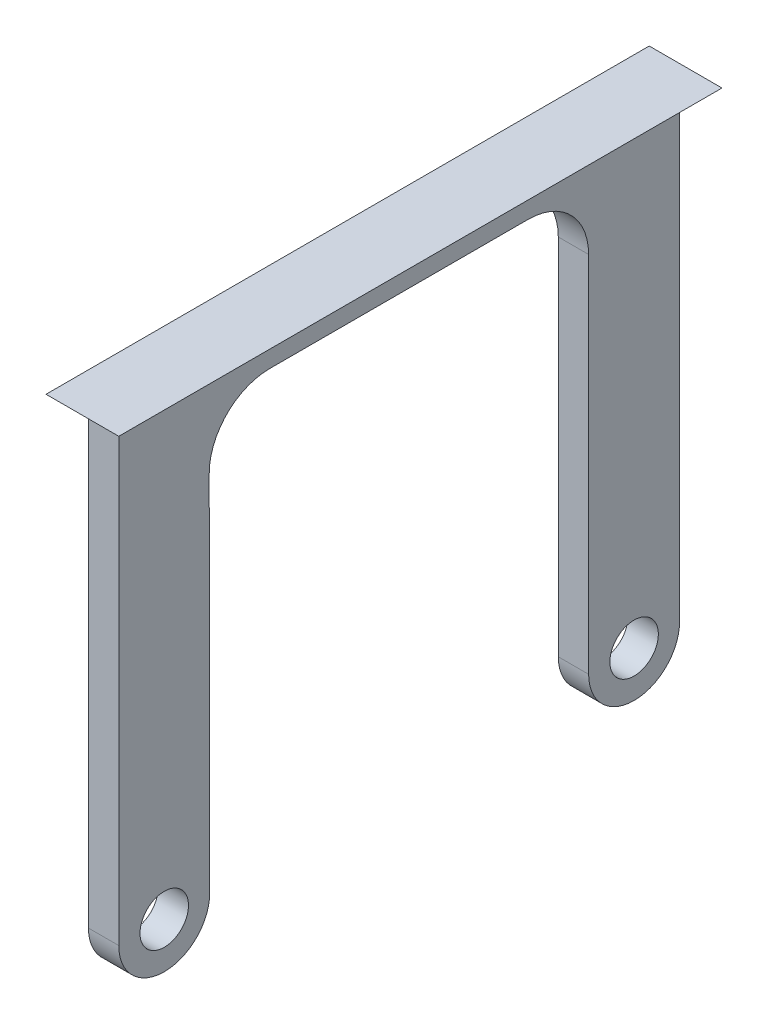
ISO-10303-21;
HEADER;
FILE_DESCRIPTION(('STEP AP214'),'2;1');
FILE_NAME('part.step','',(''),(''),'','','');
FILE_SCHEMA(('AUTOMOTIVE_DESIGN { 1 0 10303 214 1 1 1 1 }'));
ENDSEC;
DATA;
#1=APPLICATION_CONTEXT('core data for automotive mechanical design processes');
#2=APPLICATION_PROTOCOL_DEFINITION('international standard','automotive_design',2000,#1);
#3=PRODUCT_CONTEXT('',#1,'mechanical');
#4=PRODUCT('Part','Part','',(#3));
#5=PRODUCT_RELATED_PRODUCT_CATEGORY('part','',(#4));
#6=PRODUCT_DEFINITION_FORMATION('','',#4);
#7=PRODUCT_DEFINITION_CONTEXT('part definition',#1,'design');
#8=PRODUCT_DEFINITION('design','',#6,#7);
#9=PRODUCT_DEFINITION_SHAPE('','',#8);
#10=(LENGTH_UNIT() NAMED_UNIT(*) SI_UNIT(.MILLI.,.METRE.));
#11=(NAMED_UNIT(*) PLANE_ANGLE_UNIT() SI_UNIT($,.RADIAN.));
#12=(NAMED_UNIT(*) SI_UNIT($,.STERADIAN.) SOLID_ANGLE_UNIT());
#13=UNCERTAINTY_MEASURE_WITH_UNIT(LENGTH_MEASURE(1.E-05),#10,'distance_accuracy_value','');
#14=(GEOMETRIC_REPRESENTATION_CONTEXT(3) GLOBAL_UNCERTAINTY_ASSIGNED_CONTEXT((#13)) GLOBAL_UNIT_ASSIGNED_CONTEXT((#10,
#11,#12)) REPRESENTATION_CONTEXT('',''));
#15=CARTESIAN_POINT('',(0.,0.,0.));
#16=DIRECTION('',(0.,0.,1.));
#17=DIRECTION('',(1.,0.,0.));
#18=AXIS2_PLACEMENT_3D('',#15,#16,#17);
#19=CARTESIAN_POINT('',(43.5526896518253,5.18551571692412,2.50000000000003));
#20=DIRECTION('',(0.,-1.,0.));
#21=DIRECTION('',(0.,0.,-1.));
#22=AXIS2_PLACEMENT_3D('',#19,#20,#21);
#23=PLANE('',#22);
#24=DIRECTION('',(1.,0.,0.));
#25=VECTOR('',#24,1.);
#26=CARTESIAN_POINT('',(33.2516896518253,5.18551571692412,2.60000000000002));
#27=LINE('',#26,#25);
#28=CARTESIAN_POINT('',(36.6526896518253,5.18551571692412,2.60000000000002));
#29=VERTEX_POINT('',#28);
#30=CARTESIAN_POINT('',(31.8516896518253,5.18551571692412,2.60000000000002));
#31=VERTEX_POINT('',#30);
#32=EDGE_CURVE('E363',#29,#31,#27,.F.);
#33=ORIENTED_EDGE('',*,*,#32,.T.);
#34=DIRECTION('',(0.,0.,-1.));
#35=VECTOR('',#34,1.);
#36=CARTESIAN_POINT('',(31.8516896518253,5.18551571692412,41.));
#37=LINE('',#36,#35);
#38=CARTESIAN_POINT('',(31.8516896518253,5.18551571692412,42.4));
#39=VERTEX_POINT('',#38);
#40=EDGE_CURVE('E358',#31,#39,#37,.F.);
#41=ORIENTED_EDGE('',*,*,#40,.T.);
#42=DIRECTION('',(1.,0.,0.));
#43=VECTOR('',#42,1.);
#44=CARTESIAN_POINT('',(35.2526896518253,5.18551571692412,42.4));
#45=LINE('',#44,#43);
#46=CARTESIAN_POINT('',(36.6526896518253,5.18551571692412,42.4));
#47=VERTEX_POINT('',#46);
#48=EDGE_CURVE('E11',#39,#47,#45,.T.);
#49=ORIENTED_EDGE('',*,*,#48,.T.);
#50=DIRECTION('',(0.,0.,-1.));
#51=VECTOR('',#50,1.);
#52=CARTESIAN_POINT('',(36.6526896518253,5.18551571692412,45.));
#53=LINE('',#52,#51);
#54=EDGE_CURVE('E40',#47,#29,#53,.T.);
#55=ORIENTED_EDGE('',*,*,#54,.T.);
#56=EDGE_LOOP('',(#33,#41,#49,#55));
#57=FACE_BOUND('',#56,.T.);
#58=ADVANCED_FACE('F32',(#57),#23,.F.);
#59=CARTESIAN_POINT('',(33.2526896518253,-25.3144842830759,7.00000000000002));
#60=DIRECTION('',(-1.,0.,0.));
#61=DIRECTION('',(0.,0.,1.));
#62=AXIS2_PLACEMENT_3D('',#59,#60,#61);
#63=PLANE('',#62);
#64=CARTESIAN_POINT('',(33.2526896518253,-25.3144842830759,7.00000000000002));
#65=DIRECTION('',(-1.,0.,0.));
#66=DIRECTION('',(0.,0.,1.));
#67=AXIS2_PLACEMENT_3D('',#64,#65,#66);
#68=CIRCLE('',#67,3.);
#69=CARTESIAN_POINT('',(33.2526896518253,-25.3144842830759,10.));
#70=VERTEX_POINT('',#69);
#71=CARTESIAN_POINT('',(33.2526896518253,-25.3144842830759,4.00000000000002));
#72=VERTEX_POINT('',#71);
#73=EDGE_CURVE('E159',#70,#72,#68,.T.);
#74=ORIENTED_EDGE('',*,*,#73,.T.);
#75=EDGE_CURVE('E156',#72,#70,#68,.T.);
#76=ORIENTED_EDGE('',*,*,#75,.T.);
#77=EDGE_LOOP('',(#74,#76));
#78=FACE_BOUND('',#77,.T.);
#79=CARTESIAN_POINT('',(33.2526896518253,-25.3144842830759,7.00000000000002));
#80=DIRECTION('',(-1.,0.,0.));
#81=DIRECTION('',(0.,0.,1.));
#82=AXIS2_PLACEMENT_3D('',#79,#80,#81);
#83=CIRCLE('',#82,1.6);
#84=CARTESIAN_POINT('',(33.2526896518253,-25.3144842830759,8.60000000000002));
#85=VERTEX_POINT('',#84);
#86=EDGE_CURVE('E157',#85,#85,#83,.T.);
#87=ORIENTED_EDGE('',*,*,#86,.F.);
#88=EDGE_LOOP('',(#87));
#89=FACE_BOUND('',#88,.T.);
#90=ADVANCED_FACE('F316',(#78,#89),#63,.T.);
#91=CARTESIAN_POINT('',(33.2526896518253,-25.3144842830759,7.00000000000002));
#92=DIRECTION('',(1.,0.,0.));
#93=DIRECTION('',(0.,0.,-1.));
#94=AXIS2_PLACEMENT_3D('',#91,#92,#93);
#95=CYLINDRICAL_SURFACE('',#94,1.6);
#96=ORIENTED_EDGE('',*,*,#86,.T.);
#97=EDGE_LOOP('',(#96));
#98=FACE_BOUND('',#97,.T.);
#99=CARTESIAN_POINT('',(35.2526896518253,-25.3144842830759,7.00000000000002));
#100=DIRECTION('',(-1.,0.,0.));
#101=DIRECTION('',(0.,0.,1.));
#102=AXIS2_PLACEMENT_3D('',#99,#100,#101);
#103=CIRCLE('',#102,1.6);
#104=CARTESIAN_POINT('',(35.2526896518253,-25.3144842830759,8.60000000000002));
#105=VERTEX_POINT('',#104);
#106=EDGE_CURVE('E162',#105,#105,#103,.T.);
#107=ORIENTED_EDGE('',*,*,#106,.F.);
#108=EDGE_LOOP('',(#107));
#109=FACE_BOUND('',#108,.T.);
#110=ADVANCED_FACE('F322',(#98,#109),#95,.F.);
#111=CARTESIAN_POINT('',(33.2526896518253,-25.3144842830759,38.));
#112=DIRECTION('',(1.,0.,0.));
#113=DIRECTION('',(0.,0.,-1.));
#114=AXIS2_PLACEMENT_3D('',#111,#112,#113);
#115=CYLINDRICAL_SURFACE('',#114,1.6);
#116=CARTESIAN_POINT('',(33.2526896518253,-25.3144842830759,38.));
#117=DIRECTION('',(-1.,0.,0.));
#118=DIRECTION('',(0.,0.,1.));
#119=AXIS2_PLACEMENT_3D('',#116,#117,#118);
#120=CIRCLE('',#119,1.6);
#121=CARTESIAN_POINT('',(33.2526896518253,-25.3144842830759,39.6));
#122=VERTEX_POINT('',#121);
#123=EDGE_CURVE('E167',#122,#122,#120,.T.);
#124=ORIENTED_EDGE('',*,*,#123,.T.);
#125=EDGE_LOOP('',(#124));
#126=FACE_BOUND('',#125,.T.);
#127=CARTESIAN_POINT('',(35.2526896518253,-25.3144842830759,38.));
#128=DIRECTION('',(-1.,0.,0.));
#129=DIRECTION('',(0.,0.,1.));
#130=AXIS2_PLACEMENT_3D('',#127,#128,#129);
#131=CIRCLE('',#130,1.6);
#132=CARTESIAN_POINT('',(35.2526896518253,-25.3144842830759,39.6));
#133=VERTEX_POINT('',#132);
#134=EDGE_CURVE('E151',#133,#133,#131,.T.);
#135=ORIENTED_EDGE('',*,*,#134,.F.);
#136=EDGE_LOOP('',(#135));
#137=FACE_BOUND('',#136,.T.);
#138=ADVANCED_FACE('F204',(#126,#137),#115,.F.);
#139=CARTESIAN_POINT('',(33.2526896518253,-25.3144842830759,38.));
#140=DIRECTION('',(1.,0.,0.));
#141=DIRECTION('',(0.,0.,-1.));
#142=AXIS2_PLACEMENT_3D('',#139,#140,#141);
#143=CYLINDRICAL_SURFACE('',#142,3.);
#144=CARTESIAN_POINT('',(33.2526896518253,-25.3144842830759,38.));
#145=DIRECTION('',(-1.,0.,0.));
#146=DIRECTION('',(0.,0.,1.));
#147=AXIS2_PLACEMENT_3D('',#144,#145,#146);
#148=CIRCLE('',#147,3.);
#149=CARTESIAN_POINT('',(33.2526896518253,-25.3103570631996,35.000002838992));
#150=VERTEX_POINT('',#149);
#151=CARTESIAN_POINT('',(33.2524396518253,-25.3144842830759,41.));
#152=VERTEX_POINT('',#151);
#153=EDGE_CURVE('E177',#150,#152,#148,.T.);
#154=ORIENTED_EDGE('',*,*,#153,.F.);
#155=CARTESIAN_POINT('',(35.2526896518253,-25.3103570671053,35.0000056779813));
#156=DIRECTION('',(-1.,0.,0.));
#157=VECTOR('',#156,1.);
#158=LINE('',#155,#157);
#159=CARTESIAN_POINT('',(35.2526896518253,-25.3124206731378,35.000001419496));
#160=VERTEX_POINT('',#159);
#161=EDGE_CURVE('E187',#160,#150,#158,.T.);
#162=ORIENTED_EDGE('',*,*,#161,.F.);
#163=CARTESIAN_POINT('',(35.2526896518253,-25.3144842830759,38.));
#164=DIRECTION('',(-1.,0.,0.));
#165=DIRECTION('',(0.,0.,1.));
#166=AXIS2_PLACEMENT_3D('',#163,#164,#165);
#167=CIRCLE('',#166,3.);
#168=CARTESIAN_POINT('',(35.2526896518253,-25.3144842830759,41.));
#169=VERTEX_POINT('',#168);
#170=EDGE_CURVE('E170',#160,#169,#167,.T.);
#171=ORIENTED_EDGE('',*,*,#170,.T.);
#172=DIRECTION('',(1.,0.,0.));
#173=VECTOR('',#172,1.);
#174=CARTESIAN_POINT('',(33.2526896518253,-25.3144842830759,41.));
#175=LINE('',#174,#173);
#176=EDGE_CURVE('E140',#169,#152,#175,.F.);
#177=ORIENTED_EDGE('',*,*,#176,.T.);
#178=EDGE_LOOP('',(#154,#162,#171,#177));
#179=FACE_BOUND('',#178,.T.);
#180=ADVANCED_FACE('F194',(#179),#143,.T.);
#181=CARTESIAN_POINT('',(33.2526896518253,-25.3144842830759,7.00000000000002));
#182=DIRECTION('',(1.,0.,0.));
#183=DIRECTION('',(0.,0.,-1.));
#184=AXIS2_PLACEMENT_3D('',#181,#182,#183);
#185=CYLINDRICAL_SURFACE('',#184,3.);
#186=CARTESIAN_POINT('',(35.2526896518253,-25.3144842830759,7.00000000000002));
#187=DIRECTION('',(-1.,0.,0.));
#188=DIRECTION('',(0.,0.,1.));
#189=AXIS2_PLACEMENT_3D('',#186,#187,#188);
#190=CIRCLE('',#189,3.);
#191=CARTESIAN_POINT('',(35.2526896518253,-25.3144842830759,4.00000000000002));
#192=VERTEX_POINT('',#191);
#193=CARTESIAN_POINT('',(35.2526896518253,-25.3144842830759,10.));
#194=VERTEX_POINT('',#193);
#195=EDGE_CURVE('E134',#192,#194,#190,.T.);
#196=ORIENTED_EDGE('',*,*,#195,.T.);
#197=DIRECTION('',(1.,0.,0.));
#198=VECTOR('',#197,1.);
#199=CARTESIAN_POINT('',(33.2526896518253,-25.3144842830759,10.));
#200=LINE('',#199,#198);
#201=EDGE_CURVE('E144',#194,#70,#200,.F.);
#202=ORIENTED_EDGE('',*,*,#201,.T.);
#203=ORIENTED_EDGE('',*,*,#75,.F.);
#204=DIRECTION('',(1.,0.,0.));
#205=VECTOR('',#204,1.);
#206=CARTESIAN_POINT('',(33.2526896518253,-25.3144842830759,4.00000000000002));
#207=LINE('',#206,#205);
#208=EDGE_CURVE('E152',#192,#72,#207,.F.);
#209=ORIENTED_EDGE('',*,*,#208,.F.);
#210=EDGE_LOOP('',(#196,#202,#203,#209));
#211=FACE_BOUND('',#210,.T.);
#212=ADVANCED_FACE('F155',(#211),#185,.T.);
#213=CARTESIAN_POINT('',(33.2526896518253,-25.3144842830759,38.));
#214=DIRECTION('',(-1.,0.,0.));
#215=DIRECTION('',(0.,0.,1.));
#216=AXIS2_PLACEMENT_3D('',#213,#214,#215);
#217=PLANE('',#216);
#218=CARTESIAN_POINT('',(33.2526896518253,-25.3144842830759,41.));
#219=CARTESIAN_POINT('',(33.2526896518253,-24.7183013313696,41.));
#220=CARTESIAN_POINT('',(33.2526896518253,-24.1669106348504,40.7718359839461));
#221=CARTESIAN_POINT('',(33.2526896518253,-23.6162723328336,40.5439833067531));
#222=CARTESIAN_POINT('',(33.2526896518253,-23.1938936614894,40.122049814599));
#223=CARTESIAN_POINT('',(33.2526896518253,-22.7722932176084,39.7008937296709));
#224=CARTESIAN_POINT('',(33.2526896518253,-22.5434383365467,39.1494800399416));
#225=CARTESIAN_POINT('',(33.2526896518253,-22.3150051177659,38.5990823230989));
#226=CARTESIAN_POINT('',(33.2526896518253,-22.314484992824,38.0020636104264));
#227=CARTESIAN_POINT('',(33.2526896518253,-22.3139658262058,37.4061448973315));
#228=CARTESIAN_POINT('',(33.2526896518253,-22.5418595732497,36.8543332864828));
#229=CARTESIAN_POINT('',(33.2526896518253,-22.7693334288906,36.3035383816847));
#230=CARTESIAN_POINT('',(33.2526896518253,-23.1909762795449,35.8808695748161));
#231=CARTESIAN_POINT('',(33.2526896518253,-23.6118422584793,35.4589795299791));
#232=CARTESIAN_POINT('',(33.2526896518253,-24.1630983953123,35.2297454020508));
#233=CARTESIAN_POINT('',(33.2526896518253,-24.7136029342889,35.0008238182696));
#234=CARTESIAN_POINT('',(33.2526896518253,-25.3103570631996,35.000002838992));
#235=B_SPLINE_CURVE_WITH_KNOTS('',2,(#218,#219,#220,#221,#222,#223,#224,#225,#226,#227,#228,
#229,#230,#231,#232,#233,#234),.UNSPECIFIED.,.F.,.F.,(3,2,2,2,2,2,2,2,3),(0.,0.125,0.25,0.375,
0.5,0.625,0.75,0.875,1.),.UNSPECIFIED.);
#236=EDGE_CURVE('E180',#152,#150,#235,.T.);
#237=ORIENTED_EDGE('',*,*,#236,.T.);
#238=ORIENTED_EDGE('',*,*,#153,.T.);
#239=EDGE_LOOP('',(#237,#238));
#240=FACE_BOUND('',#239,.T.);
#241=ORIENTED_EDGE('',*,*,#123,.F.);
#242=EDGE_LOOP('',(#241));
#243=FACE_BOUND('',#242,.T.);
#244=ADVANCED_FACE('F205',(#240,#243),#217,.T.);
#245=CARTESIAN_POINT('',(33.2516896518253,-25.3144842830759,35.));
#246=DIRECTION('',(0.,-0.00137573995875575,0.999999053669335));
#247=DIRECTION('',(0.,-0.999999053669335,-0.00137573995875575));
#248=AXIS2_PLACEMENT_3D('',#245,#246,#247);
#249=PLANE('',#248);
#250=DIRECTION('',(1.,0.,0.));
#251=VECTOR('',#250,1.);
#252=CARTESIAN_POINT('',(33.2516896518253,-1.33080092857577,35.0329953427735));
#253=LINE('',#252,#251);
#254=CARTESIAN_POINT('',(33.2516896518253,-1.33080092857577,35.0329953427735));
#255=VERTEX_POINT('',#254);
#256=CARTESIAN_POINT('',(35.2526896518253,-1.33080092857577,35.0329953427735));
#257=VERTEX_POINT('',#256);
#258=EDGE_CURVE('E264',#255,#257,#253,.T.);
#259=ORIENTED_EDGE('',*,*,#258,.T.);
#260=DIRECTION('',(0.,-0.999999053669335,-0.00137573995875575));
#261=VECTOR('',#260,1.);
#262=CARTESIAN_POINT('',(35.2526896518253,-25.3144842830759,35.));
#263=LINE('',#262,#261);
#264=EDGE_CURVE('E227',#257,#160,#263,.T.);
#265=ORIENTED_EDGE('',*,*,#264,.T.);
#266=ORIENTED_EDGE('',*,*,#161,.T.);
#267=DIRECTION('',(0.,-0.999999053669335,-0.00137573995875575));
#268=VECTOR('',#267,1.);
#269=CARTESIAN_POINT('',(33.2516896518253,-25.3144842830759,35.));
#270=LINE('',#269,#268);
#271=EDGE_CURVE('E257',#255,#150,#270,.T.);
#272=ORIENTED_EDGE('',*,*,#271,.F.);
#273=EDGE_LOOP('',(#259,#265,#266,#272));
#274=FACE_BOUND('',#273,.T.);
#275=ADVANCED_FACE('F305',(#274),#249,.F.);
#276=CARTESIAN_POINT('',(33.2516896518253,-1.32529796874072,31.0329991280961));
#277=DIRECTION('',(1.,0.,0.));
#278=DIRECTION('',(0.,0.,-1.));
#279=AXIS2_PLACEMENT_3D('',#276,#277,#278);
#280=CYLINDRICAL_SURFACE('',#279,4.);
#281=DIRECTION('',(1.,0.,0.));
#282=VECTOR('',#281,1.);
#283=CARTESIAN_POINT('',(33.2516896518253,2.67470203125928,31.0329991280961));
#284=LINE('',#283,#282);
#285=CARTESIAN_POINT('',(33.2516896518253,2.67470203125928,31.0329991280961));
#286=VERTEX_POINT('',#285);
#287=CARTESIAN_POINT('',(35.2526896518253,2.67470203125928,31.0329991280961));
#288=VERTEX_POINT('',#287);
#289=EDGE_CURVE('E266',#286,#288,#284,.T.);
#290=ORIENTED_EDGE('',*,*,#289,.T.);
#291=CARTESIAN_POINT('',(35.2526896518253,-1.32529796874072,31.0329991280961));
#292=DIRECTION('',(1.,0.,0.));
#293=DIRECTION('',(0.,0.,-1.));
#294=AXIS2_PLACEMENT_3D('',#291,#292,#293);
#295=CIRCLE('',#294,4.);
#296=EDGE_CURVE('E236',#288,#257,#295,.T.);
#297=ORIENTED_EDGE('',*,*,#296,.T.);
#298=ORIENTED_EDGE('',*,*,#258,.F.);
#299=CARTESIAN_POINT('',(33.2516896518253,-1.32529796874072,31.0329991280961));
#300=DIRECTION('',(1.,0.,0.));
#301=DIRECTION('',(0.,0.,-1.));
#302=AXIS2_PLACEMENT_3D('',#299,#300,#301);
#303=CIRCLE('',#302,4.);
#304=EDGE_CURVE('E255',#286,#255,#303,.T.);
#305=ORIENTED_EDGE('',*,*,#304,.F.);
#306=EDGE_LOOP('',(#290,#297,#298,#305));
#307=FACE_BOUND('',#306,.T.);
#308=ADVANCED_FACE('F302',(#307),#280,.F.);
#309=CARTESIAN_POINT('',(33.2516896518253,2.67470203125928,14.));
#310=DIRECTION('',(0.,1.,0.));
#311=DIRECTION('',(0.,0.,1.));
#312=AXIS2_PLACEMENT_3D('',#309,#310,#311);
#313=PLANE('',#312);
#314=DIRECTION('',(1.,0.,0.));
#315=VECTOR('',#314,1.);
#316=CARTESIAN_POINT('',(33.2516896518253,2.67470203125928,14.));
#317=LINE('',#316,#315);
#318=CARTESIAN_POINT('',(33.2516896518253,2.67470203125928,14.));
#319=VERTEX_POINT('',#318);
#320=CARTESIAN_POINT('',(35.2526896518253,2.67470203125928,14.));
#321=VERTEX_POINT('',#320);
#322=EDGE_CURVE('E268',#319,#321,#317,.T.);
#323=ORIENTED_EDGE('',*,*,#322,.T.);
#324=DIRECTION('',(0.,0.,1.));
#325=VECTOR('',#324,1.);
#326=CARTESIAN_POINT('',(35.2526896518253,2.67470203125928,14.));
#327=LINE('',#326,#325);
#328=EDGE_CURVE('E295',#321,#288,#327,.T.);
#329=ORIENTED_EDGE('',*,*,#328,.T.);
#330=ORIENTED_EDGE('',*,*,#289,.F.);
#331=DIRECTION('',(0.,0.,1.));
#332=VECTOR('',#331,1.);
#333=CARTESIAN_POINT('',(33.2516896518253,2.67470203125928,14.));
#334=LINE('',#333,#332);
#335=EDGE_CURVE('E253',#319,#286,#334,.T.);
#336=ORIENTED_EDGE('',*,*,#335,.F.);
#337=EDGE_LOOP('',(#323,#329,#330,#336));
#338=FACE_BOUND('',#337,.T.);
#339=ADVANCED_FACE('F312',(#338),#313,.F.);
#340=CARTESIAN_POINT('',(33.2516896518253,-1.32529796874072,14.));
#341=DIRECTION('',(1.,0.,0.));
#342=DIRECTION('',(0.,0.,-1.));
#343=AXIS2_PLACEMENT_3D('',#340,#341,#342);
#344=CYLINDRICAL_SURFACE('',#343,4.);
#345=DIRECTION('',(1.,0.,0.));
#346=VECTOR('',#345,1.);
#347=CARTESIAN_POINT('',(33.2516896518253,-1.32529796874075,10.));
#348=LINE('',#347,#346);
#349=CARTESIAN_POINT('',(33.2516896518253,-1.32529796874075,10.));
#350=VERTEX_POINT('',#349);
#351=CARTESIAN_POINT('',(35.2526896518253,-1.32529796874075,10.));
#352=VERTEX_POINT('',#351);
#353=EDGE_CURVE('E270',#350,#352,#348,.T.);
#354=ORIENTED_EDGE('',*,*,#353,.T.);
#355=CARTESIAN_POINT('',(35.2526896518253,-1.32529796874072,14.));
#356=DIRECTION('',(1.,0.,0.));
#357=DIRECTION('',(0.,0.,1.));
#358=AXIS2_PLACEMENT_3D('',#355,#356,#357);
#359=CIRCLE('',#358,4.);
#360=EDGE_CURVE('E137',#352,#321,#359,.T.);
#361=ORIENTED_EDGE('',*,*,#360,.T.);
#362=ORIENTED_EDGE('',*,*,#322,.F.);
#363=CARTESIAN_POINT('',(33.2516896518253,-1.32529796874072,14.));
#364=DIRECTION('',(1.,0.,0.));
#365=DIRECTION('',(0.,0.,1.));
#366=AXIS2_PLACEMENT_3D('',#363,#364,#365);
#367=CIRCLE('',#366,4.);
#368=EDGE_CURVE('E251',#350,#319,#367,.T.);
#369=ORIENTED_EDGE('',*,*,#368,.F.);
#370=EDGE_LOOP('',(#354,#361,#362,#369));
#371=FACE_BOUND('',#370,.T.);
#372=ADVANCED_FACE('F382',(#371),#344,.F.);
#373=CARTESIAN_POINT('',(33.2516896518253,-1.32529796874075,10.));
#374=DIRECTION('',(0.,0.,-1.));
#375=DIRECTION('',(0.,1.,0.));
#376=AXIS2_PLACEMENT_3D('',#373,#374,#375);
#377=PLANE('',#376);
#378=DIRECTION('',(1.,0.,0.));
#379=VECTOR('',#378,1.);
#380=CARTESIAN_POINT('',(33.2516896518253,-25.3144842830759,10.));
#381=LINE('',#380,#379);
#382=CARTESIAN_POINT('',(33.2516896518253,-25.3144842830759,10.));
#383=VERTEX_POINT('',#382);
#384=EDGE_CURVE('E147',#383,#70,#381,.T.);
#385=ORIENTED_EDGE('',*,*,#384,.T.);
#386=ORIENTED_EDGE('',*,*,#201,.F.);
#387=DIRECTION('',(0.,1.,0.));
#388=VECTOR('',#387,1.);
#389=CARTESIAN_POINT('',(35.2526896518253,-1.32529796874075,10.));
#390=LINE('',#389,#388);
#391=EDGE_CURVE('E128',#194,#352,#390,.T.);
#392=ORIENTED_EDGE('',*,*,#391,.T.);
#393=ORIENTED_EDGE('',*,*,#353,.F.);
#394=DIRECTION('',(0.,1.,0.));
#395=VECTOR('',#394,1.);
#396=CARTESIAN_POINT('',(33.2516896518253,-1.32529796874075,10.));
#397=LINE('',#396,#395);
#398=EDGE_CURVE('E249',#383,#350,#397,.T.);
#399=ORIENTED_EDGE('',*,*,#398,.F.);
#400=EDGE_LOOP('',(#385,#386,#392,#393,#399));
#401=FACE_BOUND('',#400,.T.);
#402=ADVANCED_FACE('F145',(#401),#377,.F.);
#403=CARTESIAN_POINT('',(33.2516896518253,-25.3144842830759,7.00000000000002));
#404=DIRECTION('',(1.,0.,0.));
#405=DIRECTION('',(0.,0.,-1.));
#406=AXIS2_PLACEMENT_3D('',#403,#404,#405);
#407=CYLINDRICAL_SURFACE('',#406,3.);
#408=DIRECTION('',(1.,0.,0.));
#409=VECTOR('',#408,1.);
#410=CARTESIAN_POINT('',(33.2516896518253,-25.3144842830759,4.00000000000002));
#411=LINE('',#410,#409);
#412=CARTESIAN_POINT('',(33.2516896518253,-25.3144842830759,4.00000000000002));
#413=VERTEX_POINT('',#412);
#414=EDGE_CURVE('E260',#413,#72,#411,.T.);
#415=ORIENTED_EDGE('',*,*,#414,.T.);
#416=ORIENTED_EDGE('',*,*,#73,.F.);
#417=ORIENTED_EDGE('',*,*,#384,.F.);
#418=CARTESIAN_POINT('',(33.2516896518253,-25.3144842830759,7.00000000000002));
#419=DIRECTION('',(1.,0.,0.));
#420=DIRECTION('',(0.,0.,-1.));
#421=AXIS2_PLACEMENT_3D('',#418,#419,#420);
#422=CIRCLE('',#421,3.);
#423=EDGE_CURVE('E246',#413,#383,#422,.T.);
#424=ORIENTED_EDGE('',*,*,#423,.F.);
#425=EDGE_LOOP('',(#415,#416,#417,#424));
#426=FACE_BOUND('',#425,.T.);
#427=ADVANCED_FACE('F211',(#426),#407,.F.);
#428=CARTESIAN_POINT('',(35.2526896518253,-25.3144842830759,7.00000000000002));
#429=DIRECTION('',(1.,0.,0.));
#430=DIRECTION('',(0.,0.,-1.));
#431=AXIS2_PLACEMENT_3D('',#428,#429,#430);
#432=PLANE('',#431);
#433=DIRECTION('',(0.,-1.,0.));
#434=VECTOR('',#433,1.);
#435=CARTESIAN_POINT('',(35.2526896518253,-25.3144842830759,4.00000000000002));
#436=LINE('',#435,#434);
#437=CARTESIAN_POINT('',(35.2526896518253,3.78551571692411,4.00000000000002));
#438=VERTEX_POINT('',#437);
#439=EDGE_CURVE('E244',#438,#192,#436,.T.);
#440=ORIENTED_EDGE('',*,*,#439,.F.);
#441=DIRECTION('',(0.,0.,-1.));
#442=VECTOR('',#441,1.);
#443=CARTESIAN_POINT('',(35.2526896518253,3.78551571692412,7.00000000000002));
#444=LINE('',#443,#442);
#445=CARTESIAN_POINT('',(35.2526896518253,3.78551571692412,41.));
#446=VERTEX_POINT('',#445);
#447=EDGE_CURVE('E348',#438,#446,#444,.F.);
#448=ORIENTED_EDGE('',*,*,#447,.T.);
#449=DIRECTION('',(0.,1.,0.));
#450=VECTOR('',#449,1.);
#451=CARTESIAN_POINT('',(35.2526896518253,5.18551571692412,41.));
#452=LINE('',#451,#450);
#453=EDGE_CURVE('E235',#169,#446,#452,.T.);
#454=ORIENTED_EDGE('',*,*,#453,.F.);
#455=ORIENTED_EDGE('',*,*,#170,.F.);
#456=ORIENTED_EDGE('',*,*,#264,.F.);
#457=ORIENTED_EDGE('',*,*,#296,.F.);
#458=ORIENTED_EDGE('',*,*,#328,.F.);
#459=ORIENTED_EDGE('',*,*,#360,.F.);
#460=ORIENTED_EDGE('',*,*,#391,.F.);
#461=ORIENTED_EDGE('',*,*,#195,.F.);
#462=EDGE_LOOP('',(#440,#448,#454,#455,#456,#457,#458,#459,#460,#461));
#463=FACE_BOUND('',#462,.T.);
#464=ORIENTED_EDGE('',*,*,#134,.T.);
#465=EDGE_LOOP('',(#464));
#466=FACE_BOUND('',#465,.T.);
#467=ORIENTED_EDGE('',*,*,#106,.T.);
#468=EDGE_LOOP('',(#467));
#469=FACE_BOUND('',#468,.T.);
#470=ADVANCED_FACE('F131',(#463,#466,#469),#432,.T.);
#471=CARTESIAN_POINT('',(33.2516896518253,5.18551571692412,41.));
#472=DIRECTION('',(0.,0.,-1.));
#473=DIRECTION('',(-1.,0.,0.));
#474=AXIS2_PLACEMENT_3D('',#471,#472,#473);
#475=PLANE('',#474);
#476=ORIENTED_EDGE('',*,*,#453,.T.);
#477=DIRECTION('',(1.,0.,0.));
#478=VECTOR('',#477,1.);
#479=CARTESIAN_POINT('',(33.2516896518253,3.78551571692412,41.));
#480=LINE('',#479,#478);
#481=CARTESIAN_POINT('',(33.2516896518253,3.78551571692412,41.));
#482=VERTEX_POINT('',#481);
#483=EDGE_CURVE('E356',#446,#482,#480,.F.);
#484=ORIENTED_EDGE('',*,*,#483,.T.);
#485=DIRECTION('',(0.,1.,0.));
#486=VECTOR('',#485,1.);
#487=CARTESIAN_POINT('',(33.2516896518253,5.18551571692412,41.));
#488=LINE('',#487,#486);
#489=EDGE_CURVE('E261',#152,#482,#488,.T.);
#490=ORIENTED_EDGE('',*,*,#489,.F.);
#491=ORIENTED_EDGE('',*,*,#176,.F.);
#492=EDGE_LOOP('',(#476,#484,#490,#491));
#493=FACE_BOUND('',#492,.T.);
#494=ADVANCED_FACE('F210',(#493),#475,.F.);
#495=CARTESIAN_POINT('',(33.2516896518253,-25.3144842830759,4.00000000000002));
#496=DIRECTION('',(0.,0.,1.));
#497=DIRECTION('',(0.,-1.,0.));
#498=AXIS2_PLACEMENT_3D('',#495,#496,#497);
#499=PLANE('',#498);
#500=DIRECTION('',(0.,-1.,0.));
#501=VECTOR('',#500,1.);
#502=CARTESIAN_POINT('',(33.2516896518253,-25.3144842830759,4.00000000000002));
#503=LINE('',#502,#501);
#504=CARTESIAN_POINT('',(33.2516896518253,3.78551571692411,4.00000000000002));
#505=VERTEX_POINT('',#504);
#506=EDGE_CURVE('E258',#505,#413,#503,.T.);
#507=ORIENTED_EDGE('',*,*,#506,.F.);
#508=DIRECTION('',(1.,0.,0.));
#509=VECTOR('',#508,1.);
#510=CARTESIAN_POINT('',(35.2526896518253,3.78551571692412,4.00000000000002));
#511=LINE('',#510,#509);
#512=EDGE_CURVE('E360',#505,#438,#511,.T.);
#513=ORIENTED_EDGE('',*,*,#512,.T.);
#514=ORIENTED_EDGE('',*,*,#439,.T.);
#515=ORIENTED_EDGE('',*,*,#208,.T.);
#516=ORIENTED_EDGE('',*,*,#414,.F.);
#517=EDGE_LOOP('',(#507,#513,#514,#515,#516));
#518=FACE_BOUND('',#517,.T.);
#519=ADVANCED_FACE('F219',(#518),#499,.F.);
#520=CARTESIAN_POINT('',(36.6526896518253,3.78551571692412,45.));
#521=DIRECTION('',(0.,0.,-1.));
#522=DIRECTION('',(-1.,0.,0.));
#523=AXIS2_PLACEMENT_3D('',#520,#521,#522);
#524=CYLINDRICAL_SURFACE('',#523,1.4);
#525=CARTESIAN_POINT('',(36.6526896518253,3.78551571692412,2.60000000000002));
#526=DIRECTION('',(-0.707106781186547,0.,-0.707106781186547));
#527=DIRECTION('',(0.707106781186547,0.,-0.707106781186547));
#528=AXIS2_PLACEMENT_3D('',#525,#526,#527);
#529=ELLIPSE('',#528,1.97989898732233,1.4);
#530=EDGE_CURVE('E347',#29,#438,#529,.F.);
#531=ORIENTED_EDGE('',*,*,#530,.F.);
#532=ORIENTED_EDGE('',*,*,#54,.F.);
#533=CARTESIAN_POINT('',(36.6526896518253,3.78551571692412,42.4));
#534=DIRECTION('',(-0.707106781186547,0.,0.707106781186547));
#535=DIRECTION('',(-0.707106781186547,0.,-0.707106781186547));
#536=AXIS2_PLACEMENT_3D('',#533,#534,#535);
#537=ELLIPSE('',#536,1.97989898732233,1.4);
#538=EDGE_CURVE('E35',#446,#47,#537,.F.);
#539=ORIENTED_EDGE('',*,*,#538,.F.);
#540=ORIENTED_EDGE('',*,*,#447,.F.);
#541=EDGE_LOOP('',(#531,#532,#539,#540));
#542=FACE_BOUND('',#541,.T.);
#543=ADVANCED_FACE('F217',(#542),#524,.F.);
#544=CARTESIAN_POINT('',(33.2516896518253,-25.3144842830759,7.00000000000002));
#545=DIRECTION('',(1.,0.,0.));
#546=DIRECTION('',(0.,0.,-1.));
#547=AXIS2_PLACEMENT_3D('',#544,#545,#546);
#548=PLANE('',#547);
#549=ORIENTED_EDGE('',*,*,#489,.T.);
#550=DIRECTION('',(0.,0.,-1.));
#551=VECTOR('',#550,1.);
#552=CARTESIAN_POINT('',(33.2516896518253,3.78551571692412,4.00000000000002));
#553=LINE('',#552,#551);
#554=EDGE_CURVE('E273',#482,#505,#553,.T.);
#555=ORIENTED_EDGE('',*,*,#554,.T.);
#556=ORIENTED_EDGE('',*,*,#506,.T.);
#557=ORIENTED_EDGE('',*,*,#423,.T.);
#558=ORIENTED_EDGE('',*,*,#398,.T.);
#559=ORIENTED_EDGE('',*,*,#368,.T.);
#560=ORIENTED_EDGE('',*,*,#335,.T.);
#561=ORIENTED_EDGE('',*,*,#304,.T.);
#562=ORIENTED_EDGE('',*,*,#271,.T.);
#563=ORIENTED_EDGE('',*,*,#236,.F.);
#564=EDGE_LOOP('',(#549,#555,#556,#557,#558,#559,#560,#561,#562,#563));
#565=FACE_BOUND('',#564,.T.);
#566=ADVANCED_FACE('F212',(#565),#548,.F.);
#567=CARTESIAN_POINT('',(33.2516896518253,3.78551571692412,2.60000000000002));
#568=DIRECTION('',(-1.,0.,0.));
#569=DIRECTION('',(0.,0.,1.));
#570=AXIS2_PLACEMENT_3D('',#567,#568,#569);
#571=CYLINDRICAL_SURFACE('',#570,1.4);
#572=ORIENTED_EDGE('',*,*,#530,.T.);
#573=ORIENTED_EDGE('',*,*,#512,.F.);
#574=CARTESIAN_POINT('',(31.8516896518253,3.78551571692412,2.60000000000002));
#575=DIRECTION('',(-0.707106781186547,0.,0.707106781186547));
#576=DIRECTION('',(-0.707106781186547,0.,-0.707106781186547));
#577=AXIS2_PLACEMENT_3D('',#574,#575,#576);
#578=ELLIPSE('',#577,1.97989898732233,1.4);
#579=EDGE_CURVE('E352',#31,#505,#578,.F.);
#580=ORIENTED_EDGE('',*,*,#579,.F.);
#581=ORIENTED_EDGE('',*,*,#32,.F.);
#582=EDGE_LOOP('',(#572,#573,#580,#581));
#583=FACE_BOUND('',#582,.T.);
#584=ADVANCED_FACE('F216',(#583),#571,.F.);
#585=CARTESIAN_POINT('',(-3.74731034817467,3.78551571692412,42.4));
#586=DIRECTION('',(-1.,0.,0.));
#587=DIRECTION('',(0.,0.,1.));
#588=AXIS2_PLACEMENT_3D('',#585,#586,#587);
#589=CYLINDRICAL_SURFACE('',#588,1.4);
#590=ORIENTED_EDGE('',*,*,#538,.T.);
#591=ORIENTED_EDGE('',*,*,#48,.F.);
#592=CARTESIAN_POINT('',(31.8516896518253,3.78551571692412,42.4));
#593=DIRECTION('',(-0.707106781186547,0.,-0.707106781186547));
#594=DIRECTION('',(-0.707106781186547,0.,0.707106781186547));
#595=AXIS2_PLACEMENT_3D('',#592,#593,#594);
#596=ELLIPSE('',#595,1.97989898732233,1.4);
#597=EDGE_CURVE('E351',#482,#39,#596,.F.);
#598=ORIENTED_EDGE('',*,*,#597,.F.);
#599=ORIENTED_EDGE('',*,*,#483,.F.);
#600=EDGE_LOOP('',(#590,#591,#598,#599));
#601=FACE_BOUND('',#600,.T.);
#602=ADVANCED_FACE('F327',(#601),#589,.F.);
#603=CARTESIAN_POINT('',(31.8516896518253,3.78551571692412,7.00000000000002));
#604=DIRECTION('',(0.,0.,1.));
#605=DIRECTION('',(1.,0.,0.));
#606=AXIS2_PLACEMENT_3D('',#603,#604,#605);
#607=CYLINDRICAL_SURFACE('',#606,1.4);
#608=ORIENTED_EDGE('',*,*,#597,.T.);
#609=ORIENTED_EDGE('',*,*,#40,.F.);
#610=ORIENTED_EDGE('',*,*,#579,.T.);
#611=ORIENTED_EDGE('',*,*,#554,.F.);
#612=EDGE_LOOP('',(#608,#609,#610,#611));
#613=FACE_BOUND('',#612,.T.);
#614=ADVANCED_FACE('F318',(#613),#607,.F.);
#615=CLOSED_SHELL('',(#58,#90,#110,#138,#180,#212,#244,#275,#308,#339,#372,#402,#427,#470,#494,
#519,#543,#566,#584,#602,#614));
#616=MANIFOLD_SOLID_BREP('B2',#615);
#617=ADVANCED_BREP_SHAPE_REPRESENTATION('',(#18,#616),#14);
#618=SHAPE_DEFINITION_REPRESENTATION(#9,#617);
ENDSEC;
END-ISO-10303-21;
